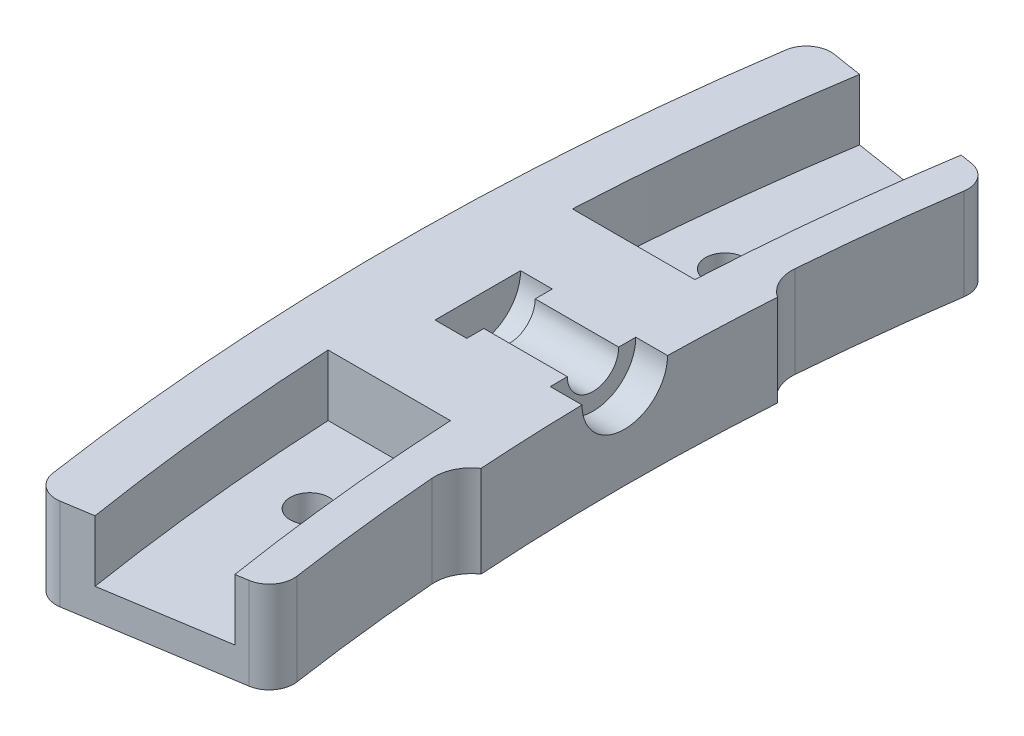
ISO-10303-21;
HEADER;
FILE_DESCRIPTION(('STEP AP214'),'2;1');
FILE_NAME('part.step','',(''),(''),'','','');
FILE_SCHEMA(('AUTOMOTIVE_DESIGN { 1 0 10303 214 1 1 1 1 }'));
ENDSEC;
DATA;
#1=APPLICATION_CONTEXT('core data for automotive mechanical design processes');
#2=APPLICATION_PROTOCOL_DEFINITION('international standard','automotive_design',2000,#1);
#3=PRODUCT_CONTEXT('',#1,'mechanical');
#4=PRODUCT('Part','Part','',(#3));
#5=PRODUCT_RELATED_PRODUCT_CATEGORY('part','',(#4));
#6=PRODUCT_DEFINITION_FORMATION('','',#4);
#7=PRODUCT_DEFINITION_CONTEXT('part definition',#1,'design');
#8=PRODUCT_DEFINITION('design','',#6,#7);
#9=PRODUCT_DEFINITION_SHAPE('','',#8);
#10=(LENGTH_UNIT() NAMED_UNIT(*) SI_UNIT(.MILLI.,.METRE.));
#11=(NAMED_UNIT(*) PLANE_ANGLE_UNIT() SI_UNIT($,.RADIAN.));
#12=(NAMED_UNIT(*) SI_UNIT($,.STERADIAN.) SOLID_ANGLE_UNIT());
#13=UNCERTAINTY_MEASURE_WITH_UNIT(LENGTH_MEASURE(1.E-05),#10,'distance_accuracy_value','');
#14=(GEOMETRIC_REPRESENTATION_CONTEXT(3) GLOBAL_UNCERTAINTY_ASSIGNED_CONTEXT((#13)) GLOBAL_UNIT_ASSIGNED_CONTEXT((#10,
#11,#12)) REPRESENTATION_CONTEXT('',''));
#15=CARTESIAN_POINT('',(0.,0.,0.));
#16=DIRECTION('',(0.,0.,1.));
#17=DIRECTION('',(1.,0.,0.));
#18=AXIS2_PLACEMENT_3D('',#15,#16,#17);
#19=CARTESIAN_POINT('',(0.,10.,0.));
#20=DIRECTION('',(0.,-1.,0.));
#21=DIRECTION('',(0.,0.,-1.));
#22=AXIS2_PLACEMENT_3D('',#19,#20,#21);
#23=CYLINDRICAL_SURFACE('',#22,185.5);
#24=CARTESIAN_POINT('',(-185.466978192885,10.,3.5));
#25=CARTESIAN_POINT('',(-185.466977430939,9.9015687384195,3.50000944061988));
#26=CARTESIAN_POINT('',(-185.467056536335,9.80314196188526,3.49584772852682));
#27=CARTESIAN_POINT('',(-185.467368855888,9.60699276190361,3.47925506337131));
#28=CARTESIAN_POINT('',(-185.467602062565,9.50927030450143,3.46682451167631));
#29=CARTESIAN_POINT('',(-185.468216741485,9.31528432602201,3.43377895386924));
#30=CARTESIAN_POINT('',(-185.468598108343,9.21901981836457,3.41316976496929));
#31=CARTESIAN_POINT('',(-185.469497617825,9.0285929662776,3.36393426603974));
#32=CARTESIAN_POINT('',(-185.470015758806,8.93443059661093,3.33530805231412));
#33=CARTESIAN_POINT('',(-185.471755316775,8.65600881932055,3.23763660090777));
#34=CARTESIAN_POINT('',(-185.473162149319,8.47573195361422,3.1567843740943));
#35=CARTESIAN_POINT('',(-185.476310472255,8.13144657686858,2.96602237242094));
#36=CARTESIAN_POINT('',(-185.478051897782,7.96743492200355,2.85611822798098));
#37=CARTESIAN_POINT('',(-185.481673830463,7.66013870584937,2.61031457726575));
#38=CARTESIAN_POINT('',(-185.483554356072,7.5168569023782,2.47441161778505));
#39=CARTESIAN_POINT('',(-185.487242545187,7.2551268801705,2.18046178905099));
#40=CARTESIAN_POINT('',(-185.489050197554,7.13668244637189,2.02241155091272));
#41=CARTESIAN_POINT('',(-185.492388616318,6.92800421618842,1.68866047564039));
#42=CARTESIAN_POINT('',(-185.493919374273,6.83777127989765,1.5129591005855));
#43=CARTESIAN_POINT('',(-185.496531252063,6.68809125509202,1.14890943189333));
#44=CARTESIAN_POINT('',(-185.497612400989,6.62864217475321,0.960561957394287));
#45=CARTESIAN_POINT('',(-185.499203226703,6.54221396354895,0.576576330685113));
#46=CARTESIAN_POINT('',(-185.499712960763,6.51523157863379,0.380938911153274));
#47=CARTESIAN_POINT('',(-185.500103688222,6.49449277728218,-0.0120942016270648));
#48=CARTESIAN_POINT('',(-185.499984667711,6.5007370959074,-0.209489933677596));
#49=CARTESIAN_POINT('',(-185.499131332768,6.54627267400048,-0.600403183315255));
#50=CARTESIAN_POINT('',(-185.498397102807,6.58555939657907,-0.793921229593717));
#51=CARTESIAN_POINT('',(-185.4963962187,6.69605748961318,-1.1716138975672));
#52=CARTESIAN_POINT('',(-185.495129566015,6.76726877236852,-1.35578854492799));
#53=CARTESIAN_POINT('',(-185.492206448889,6.93960136811131,-1.70958526125016));
#54=CARTESIAN_POINT('',(-185.490549949042,7.04072539785483,-1.8792060065811));
#55=CARTESIAN_POINT('',(-185.487033980167,7.27000593863789,-2.19905613244699));
#56=CARTESIAN_POINT('',(-185.485174520891,7.39816115100552,-2.34928644400701));
#57=CARTESIAN_POINT('',(-185.481462067495,7.67787076446033,-2.62610683719889));
#58=CARTESIAN_POINT('',(-185.479609073517,7.82942567372652,-2.75269640528488));
#59=CARTESIAN_POINT('',(-185.476117893751,8.15169764500471,-2.97867604968195));
#60=CARTESIAN_POINT('',(-185.474479776318,8.32242077279799,-3.07805748157784));
#61=CARTESIAN_POINT('',(-185.471602891485,8.67820485888656,-3.24679456806405));
#62=CARTESIAN_POINT('',(-185.470364368728,8.86327451485222,-3.31613183768991));
#63=CARTESIAN_POINT('',(-185.468429637325,9.24228661070111,-3.4226441377642));
#64=CARTESIAN_POINT('',(-185.46773260079,9.43621502360441,-3.45986827637525));
#65=CARTESIAN_POINT('',(-185.467222256108,9.69286188419213,-3.48704466585147));
#66=CARTESIAN_POINT('',(-185.467130779183,9.75424289207597,-3.49190547814548));
#67=CARTESIAN_POINT('',(-185.467008829149,9.87707430779331,-3.4983787108036));
#68=CARTESIAN_POINT('',(-185.466978255392,9.93852443293174,-3.49999649055059));
#69=CARTESIAN_POINT('',(-185.466978192885,10.,-3.5));
#70=B_SPLINE_CURVE_WITH_KNOTS('',3,(#24,#25,#26,#27,#28,#29,#30,#31,#32,#33,#34,#35,#36,#37,#38,
#39,#40,#41,#42,#43,#44,#45,#46,#47,#48,#49,#50,#51,#52,#53,#54,#55,#56,#57,#58,#59,#60,#61,#62,
#63,#64,#65,#66,#67,#68,#69),.UNSPECIFIED.,.F.,.F.,(4,2,2,2,2,2,2,2,2,2,2,2,2,2,2,2,2,2,2,2,2,2,
4),(0.,0.295197718043894,0.590381108307984,0.885354918967891,1.18032518642624,1.77001690874315,
2.35959442927563,2.9492503129033,3.5389959883104,4.12875964175322,4.71848513063973,
5.30815150799945,5.89783093037721,6.48742940000169,7.07702624994621,7.66667666511143,
8.25629875787279,8.84593365745524,9.43575567567413,10.0259381164931,10.6152164283205,
10.7998763838495,10.9842309209289),.UNSPECIFIED.);
#71=CARTESIAN_POINT('',(-185.466978192885,10.,3.5));
#72=VERTEX_POINT('',#71);
#73=CARTESIAN_POINT('',(-185.466978192885,10.,-3.5));
#74=VERTEX_POINT('',#73);
#75=EDGE_CURVE('E214',#72,#74,#70,.T.);
#76=ORIENTED_EDGE('',*,*,#75,.F.);
#77=CARTESIAN_POINT('',(0.,10.,0.));
#78=DIRECTION('',(0.,-1.,0.));
#79=DIRECTION('',(0.,0.,1.));
#80=AXIS2_PLACEMENT_3D('',#77,#78,#79);
#81=CIRCLE('',#80,185.5);
#82=CARTESIAN_POINT('',(-185.102830260761,10.,12.1322804721917));
#83=VERTEX_POINT('',#82);
#84=EDGE_CURVE('E224',#83,#72,#81,.T.);
#85=ORIENTED_EDGE('',*,*,#84,.F.);
#86=DIRECTION('',(0.,-1.,0.));
#87=VECTOR('',#86,1.);
#88=CARTESIAN_POINT('',(-185.102830260761,10.,12.1322804721917));
#89=LINE('',#88,#87);
#90=CARTESIAN_POINT('',(-185.102830260761,2.5,12.1322804721918));
#91=VERTEX_POINT('',#90);
#92=EDGE_CURVE('E231',#83,#91,#89,.T.);
#93=ORIENTED_EDGE('',*,*,#92,.T.);
#94=CARTESIAN_POINT('',(0.,2.5,0.));
#95=DIRECTION('',(0.,1.,0.));
#96=DIRECTION('',(0.,0.,-1.));
#97=AXIS2_PLACEMENT_3D('',#94,#95,#96);
#98=CIRCLE('',#97,185.5);
#99=CARTESIAN_POINT('',(-185.102830260761,2.5,-12.1322804721913));
#100=VERTEX_POINT('',#99);
#101=EDGE_CURVE('E370',#100,#91,#98,.T.);
#102=ORIENTED_EDGE('',*,*,#101,.F.);
#103=DIRECTION('',(0.,-1.,0.));
#104=VECTOR('',#103,1.);
#105=CARTESIAN_POINT('',(-185.102830260761,10.,-12.1322804721916));
#106=LINE('',#105,#104);
#107=CARTESIAN_POINT('',(-185.102830260761,10.,-12.1322804721916));
#108=VERTEX_POINT('',#107);
#109=EDGE_CURVE('E234',#108,#100,#106,.T.);
#110=ORIENTED_EDGE('',*,*,#109,.F.);
#111=EDGE_CURVE('E232',#74,#108,#81,.T.);
#112=ORIENTED_EDGE('',*,*,#111,.F.);
#113=EDGE_LOOP('',(#76,#85,#93,#102,#110,#112));
#114=FACE_BOUND('',#113,.T.);
#115=ADVANCED_FACE('F35',(#114),#23,.F.);
#116=CARTESIAN_POINT('',(0.,10.,0.));
#117=DIRECTION('',(0.,1.,0.));
#118=DIRECTION('',(0.,0.,1.));
#119=AXIS2_PLACEMENT_3D('',#116,#117,#118);
#120=PLANE('',#119);
#121=ORIENTED_EDGE('',*,*,#84,.T.);
#122=DIRECTION('',(-1.,0.,0.));
#123=VECTOR('',#122,1.);
#124=CARTESIAN_POINT('',(-197.5,10.,3.5));
#125=LINE('',#124,#123);
#126=CARTESIAN_POINT('',(-188.066978192885,10.,3.5));
#127=VERTEX_POINT('',#126);
#128=EDGE_CURVE('E11',#72,#127,#125,.T.);
#129=ORIENTED_EDGE('',*,*,#128,.T.);
#130=DIRECTION('',(0.,0.,-1.));
#131=VECTOR('',#130,1.);
#132=CARTESIAN_POINT('',(-188.066978192885,10.,0.));
#133=LINE('',#132,#131);
#134=CARTESIAN_POINT('',(-188.066978192885,10.,2.1));
#135=VERTEX_POINT('',#134);
#136=EDGE_CURVE('E207',#127,#135,#133,.T.);
#137=ORIENTED_EDGE('',*,*,#136,.T.);
#138=DIRECTION('',(-1.,0.,0.));
#139=VECTOR('',#138,1.);
#140=CARTESIAN_POINT('',(-184.97551328148,10.,2.1));
#141=LINE('',#140,#139);
#142=CARTESIAN_POINT('',(-194.9,10.,2.1));
#143=VERTEX_POINT('',#142);
#144=EDGE_CURVE('E480',#135,#143,#141,.T.);
#145=ORIENTED_EDGE('',*,*,#144,.T.);
#146=DIRECTION('',(0.,0.,-1.));
#147=VECTOR('',#146,1.);
#148=CARTESIAN_POINT('',(-194.9,10.,0.));
#149=LINE('',#148,#147);
#150=CARTESIAN_POINT('',(-194.9,10.,3.5));
#151=VERTEX_POINT('',#150);
#152=EDGE_CURVE('E479',#151,#143,#149,.T.);
#153=ORIENTED_EDGE('',*,*,#152,.F.);
#154=DIRECTION('',(-1.,0.,0.));
#155=VECTOR('',#154,1.);
#156=CARTESIAN_POINT('',(-194.9,10.,3.5));
#157=LINE('',#156,#155);
#158=CARTESIAN_POINT('',(-197.5,10.,3.5));
#159=VERTEX_POINT('',#158);
#160=EDGE_CURVE('E362',#151,#159,#157,.T.);
#161=ORIENTED_EDGE('',*,*,#160,.T.);
#162=DIRECTION('',(0.,0.,-1.));
#163=VECTOR('',#162,1.);
#164=CARTESIAN_POINT('',(-197.5,10.,0.));
#165=LINE('',#164,#163);
#166=CARTESIAN_POINT('',(-197.5,10.,-3.5));
#167=VERTEX_POINT('',#166);
#168=EDGE_CURVE('E355',#159,#167,#165,.T.);
#169=ORIENTED_EDGE('',*,*,#168,.T.);
#170=DIRECTION('',(-1.,0.,0.));
#171=VECTOR('',#170,1.);
#172=CARTESIAN_POINT('',(-194.9,10.,-3.5));
#173=LINE('',#172,#171);
#174=CARTESIAN_POINT('',(-194.9,10.,-3.5));
#175=VERTEX_POINT('',#174);
#176=EDGE_CURVE('E359',#167,#175,#173,.F.);
#177=ORIENTED_EDGE('',*,*,#176,.T.);
#178=CARTESIAN_POINT('',(-194.9,10.,-2.1));
#179=VERTEX_POINT('',#178);
#180=EDGE_CURVE('E476',#179,#175,#149,.T.);
#181=ORIENTED_EDGE('',*,*,#180,.F.);
#182=DIRECTION('',(-1.,0.,0.));
#183=VECTOR('',#182,1.);
#184=CARTESIAN_POINT('',(-184.97551328148,10.,-2.1));
#185=LINE('',#184,#183);
#186=CARTESIAN_POINT('',(-188.066978192885,10.,-2.1));
#187=VERTEX_POINT('',#186);
#188=EDGE_CURVE('E236',#179,#187,#185,.F.);
#189=ORIENTED_EDGE('',*,*,#188,.T.);
#190=CARTESIAN_POINT('',(-188.066978192885,10.,-3.5));
#191=VERTEX_POINT('',#190);
#192=EDGE_CURVE('E50',#187,#191,#133,.T.);
#193=ORIENTED_EDGE('',*,*,#192,.T.);
#194=DIRECTION('',(-1.,0.,0.));
#195=VECTOR('',#194,1.);
#196=CARTESIAN_POINT('',(-197.5,10.,-3.5));
#197=LINE('',#196,#195);
#198=EDGE_CURVE('E43',#191,#74,#197,.F.);
#199=ORIENTED_EDGE('',*,*,#198,.T.);
#200=ORIENTED_EDGE('',*,*,#111,.T.);
#201=CARTESIAN_POINT('',(-183.418657042006,10.,-14.6149323948795));
#202=DIRECTION('',(0.,1.,0.));
#203=DIRECTION('',(0.,0.,1.));
#204=AXIS2_PLACEMENT_3D('',#201,#202,#203);
#205=CIRCLE('',#204,3.);
#206=CARTESIAN_POINT('',(-186.409178624213,10.,-14.8532193361004));
#207=VERTEX_POINT('',#206);
#208=EDGE_CURVE('E323',#108,#207,#205,.F.);
#209=ORIENTED_EDGE('',*,*,#208,.T.);
#210=CARTESIAN_POINT('',(0.,10.,0.));
#211=DIRECTION('',(0.,1.,0.));
#212=DIRECTION('',(0.,0.,1.));
#213=AXIS2_PLACEMENT_3D('',#210,#211,#212);
#214=CIRCLE('',#213,187.);
#215=CARTESIAN_POINT('',(-184.996936421358,10.,-27.2971338186249));
#216=VERTEX_POINT('',#215);
#217=EDGE_CURVE('E308',#216,#207,#214,.T.);
#218=ORIENTED_EDGE('',*,*,#217,.F.);
#219=CARTESIAN_POINT('',(-186.97551328148,10.,-27.5890817739043));
#220=DIRECTION('',(0.,1.,0.));
#221=DIRECTION('',(0.,0.,1.));
#222=AXIS2_PLACEMENT_3D('',#219,#220,#221);
#223=CIRCLE('',#222,2.);
#224=CARTESIAN_POINT('',(-186.662644351399,10.,-29.5644584550946));
#225=VERTEX_POINT('',#224);
#226=EDGE_CURVE('E337',#216,#225,#223,.T.);
#227=ORIENTED_EDGE('',*,*,#226,.T.);
#228=DIRECTION('',(0.987688340595138,0.,0.156434465040232));
#229=VECTOR('',#228,1.);
#230=CARTESIAN_POINT('',(0.,10.,0.));
#231=LINE('',#230,#229);
#232=CARTESIAN_POINT('',(-187.660784713076,10.,-29.7225483576441));
#233=VERTEX_POINT('',#232);
#234=EDGE_CURVE('E310',#233,#225,#231,.T.);
#235=ORIENTED_EDGE('',*,*,#234,.F.);
#236=CARTESIAN_POINT('',(0.,10.,0.));
#237=DIRECTION('',(0.,1.,0.));
#238=DIRECTION('',(0.,0.,1.));
#239=AXIS2_PLACEMENT_3D('',#236,#237,#238);
#240=CIRCLE('',#239,190.);
#241=CARTESIAN_POINT('',(-189.736659610103,10.,-9.99999999999999));
#242=VERTEX_POINT('',#241);
#243=EDGE_CURVE('E250',#233,#242,#240,.T.);
#244=ORIENTED_EDGE('',*,*,#243,.T.);
#245=DIRECTION('',(-1.,0.,0.));
#246=VECTOR('',#245,1.);
#247=CARTESIAN_POINT('',(0.,10.,-10.));
#248=LINE('',#247,#246);
#249=CARTESIAN_POINT('',(-199.749843554382,10.,-9.99999999999999));
#250=VERTEX_POINT('',#249);
#251=EDGE_CURVE('E261',#242,#250,#248,.T.);
#252=ORIENTED_EDGE('',*,*,#251,.T.);
#253=CARTESIAN_POINT('',(0.,10.,0.));
#254=DIRECTION('',(0.,1.,0.));
#255=DIRECTION('',(0.,0.,1.));
#256=AXIS2_PLACEMENT_3D('',#253,#254,#255);
#257=CIRCLE('',#256,200.);
#258=CARTESIAN_POINT('',(-197.537668119028,10.,-31.2868930080464));
#259=VERTEX_POINT('',#258);
#260=EDGE_CURVE('E258',#259,#250,#257,.T.);
#261=ORIENTED_EDGE('',*,*,#260,.F.);
#262=CARTESIAN_POINT('',(-199.997133786041,10.,-31.6764341012137));
#263=VERTEX_POINT('',#262);
#264=EDGE_CURVE('E311',#263,#259,#231,.T.);
#265=ORIENTED_EDGE('',*,*,#264,.F.);
#266=CARTESIAN_POINT('',(-200.310002716121,10.,-29.7010574200234));
#267=DIRECTION('',(0.,1.,0.));
#268=DIRECTION('',(0.,0.,1.));
#269=AXIS2_PLACEMENT_3D('',#266,#267,#268);
#270=CIRCLE('',#269,2.);
#271=CARTESIAN_POINT('',(-202.288373113317,10.,-29.9944011970113));
#272=VERTEX_POINT('',#271);
#273=EDGE_CURVE('E343',#263,#272,#270,.T.);
#274=ORIENTED_EDGE('',*,*,#273,.T.);
#275=CARTESIAN_POINT('',(0.,10.,0.));
#276=DIRECTION('',(0.,1.,0.));
#277=DIRECTION('',(0.,0.,1.));
#278=AXIS2_PLACEMENT_3D('',#275,#276,#277);
#279=CIRCLE('',#278,204.5);
#280=CARTESIAN_POINT('',(-202.288373113317,10.,29.9944011970112));
#281=VERTEX_POINT('',#280);
#282=EDGE_CURVE('E313',#272,#281,#279,.T.);
#283=ORIENTED_EDGE('',*,*,#282,.T.);
#284=CARTESIAN_POINT('',(-200.310002716121,10.,29.7010574200233));
#285=DIRECTION('',(0.,1.,0.));
#286=DIRECTION('',(0.,0.,1.));
#287=AXIS2_PLACEMENT_3D('',#284,#285,#286);
#288=CIRCLE('',#287,2.);
#289=CARTESIAN_POINT('',(-199.997133786041,10.,31.6764341012136));
#290=VERTEX_POINT('',#289);
#291=EDGE_CURVE('E341',#281,#290,#288,.T.);
#292=ORIENTED_EDGE('',*,*,#291,.T.);
#293=DIRECTION('',(-0.987688340595138,0.,0.156434465040231));
#294=VECTOR('',#293,1.);
#295=CARTESIAN_POINT('',(0.,10.,0.));
#296=LINE('',#295,#294);
#297=CARTESIAN_POINT('',(-197.537668119028,10.,31.2868930080463));
#298=VERTEX_POINT('',#297);
#299=EDGE_CURVE('E270',#298,#290,#296,.T.);
#300=ORIENTED_EDGE('',*,*,#299,.F.);
#301=CARTESIAN_POINT('',(0.,10.,0.));
#302=DIRECTION('',(0.,1.,0.));
#303=DIRECTION('',(0.,0.,1.));
#304=AXIS2_PLACEMENT_3D('',#301,#302,#303);
#305=CIRCLE('',#304,200.);
#306=CARTESIAN_POINT('',(-199.749843554382,10.,10.));
#307=VERTEX_POINT('',#306);
#308=EDGE_CURVE('E292',#307,#298,#305,.T.);
#309=ORIENTED_EDGE('',*,*,#308,.F.);
#310=DIRECTION('',(-1.,0.,0.));
#311=VECTOR('',#310,1.);
#312=CARTESIAN_POINT('',(0.,10.,10.));
#313=LINE('',#312,#311);
#314=CARTESIAN_POINT('',(-189.736659610103,10.,10.));
#315=VERTEX_POINT('',#314);
#316=EDGE_CURVE('E290',#315,#307,#313,.T.);
#317=ORIENTED_EDGE('',*,*,#316,.F.);
#318=CARTESIAN_POINT('',(0.,10.,0.));
#319=DIRECTION('',(0.,1.,0.));
#320=DIRECTION('',(0.,0.,1.));
#321=AXIS2_PLACEMENT_3D('',#318,#319,#320);
#322=CIRCLE('',#321,190.);
#323=CARTESIAN_POINT('',(-187.660784713076,10.,29.7225483576439));
#324=VERTEX_POINT('',#323);
#325=EDGE_CURVE('E281',#315,#324,#322,.T.);
#326=ORIENTED_EDGE('',*,*,#325,.T.);
#327=CARTESIAN_POINT('',(-186.662644351399,10.,29.5644584550944));
#328=VERTEX_POINT('',#327);
#329=EDGE_CURVE('E305',#328,#324,#296,.T.);
#330=ORIENTED_EDGE('',*,*,#329,.F.);
#331=CARTESIAN_POINT('',(-186.97551328148,10.,27.5890817739042));
#332=DIRECTION('',(0.,1.,0.));
#333=DIRECTION('',(0.,0.,1.));
#334=AXIS2_PLACEMENT_3D('',#331,#332,#333);
#335=CIRCLE('',#334,2.);
#336=CARTESIAN_POINT('',(-184.996936421358,10.,27.2971338186247));
#337=VERTEX_POINT('',#336);
#338=EDGE_CURVE('E339',#328,#337,#335,.T.);
#339=ORIENTED_EDGE('',*,*,#338,.T.);
#340=CARTESIAN_POINT('',(-186.409178624213,10.,14.8532193361011));
#341=VERTEX_POINT('',#340);
#342=EDGE_CURVE('E307',#341,#337,#214,.T.);
#343=ORIENTED_EDGE('',*,*,#342,.F.);
#344=CARTESIAN_POINT('',(-183.418657042006,10.,14.6149323948802));
#345=DIRECTION('',(0.,1.,0.));
#346=DIRECTION('',(0.,0.,1.));
#347=AXIS2_PLACEMENT_3D('',#344,#345,#346);
#348=CIRCLE('',#347,3.);
#349=EDGE_CURVE('E227',#341,#83,#348,.F.);
#350=ORIENTED_EDGE('',*,*,#349,.T.);
#351=EDGE_LOOP('',(#121,#129,#137,#145,#153,#161,#169,#177,#181,#189,#193,#199,#200,#209,#218,
#227,#235,#244,#252,#261,#265,#274,#283,#292,#300,#309,#317,#326,#330,#339,#343,#350));
#352=FACE_BOUND('',#351,.T.);
#353=ADVANCED_FACE('F222',(#352),#120,.T.);
#354=CARTESIAN_POINT('',(-184.97551328148,10.,0.));
#355=DIRECTION('',(-1.,0.,0.));
#356=DIRECTION('',(0.,0.,1.));
#357=AXIS2_PLACEMENT_3D('',#354,#355,#356);
#358=CYLINDRICAL_SURFACE('',#357,2.1);
#359=ORIENTED_EDGE('',*,*,#144,.F.);
#360=CARTESIAN_POINT('',(-188.066978192885,10.,0.));
#361=DIRECTION('',(1.,0.,0.));
#362=DIRECTION('',(0.,0.,-1.));
#363=AXIS2_PLACEMENT_3D('',#360,#361,#362);
#364=CIRCLE('',#363,2.1);
#365=EDGE_CURVE('E211',#135,#187,#364,.T.);
#366=ORIENTED_EDGE('',*,*,#365,.T.);
#367=ORIENTED_EDGE('',*,*,#188,.F.);
#368=CARTESIAN_POINT('',(-194.9,10.,0.));
#369=DIRECTION('',(1.,0.,0.));
#370=DIRECTION('',(0.,0.,-1.));
#371=AXIS2_PLACEMENT_3D('',#368,#369,#370);
#372=CIRCLE('',#371,2.1);
#373=EDGE_CURVE('E357',#143,#179,#372,.T.);
#374=ORIENTED_EDGE('',*,*,#373,.F.);
#375=EDGE_LOOP('',(#359,#366,#367,#374));
#376=FACE_BOUND('',#375,.T.);
#377=ADVANCED_FACE('F490',(#376),#358,.F.);
#378=CARTESIAN_POINT('',(0.,10.,0.));
#379=DIRECTION('',(0.,-1.,0.));
#380=DIRECTION('',(0.,0.,-1.));
#381=AXIS2_PLACEMENT_3D('',#378,#379,#380);
#382=CYLINDRICAL_SURFACE('',#381,187.);
#383=DIRECTION('',(0.,-1.,0.));
#384=VECTOR('',#383,1.);
#385=CARTESIAN_POINT('',(-186.409178624213,10.,-14.8532193361004));
#386=LINE('',#385,#384);
#387=CARTESIAN_POINT('',(-186.409178624213,2.5,-14.8532193361002));
#388=VERTEX_POINT('',#387);
#389=EDGE_CURVE('E316',#207,#388,#386,.T.);
#390=ORIENTED_EDGE('',*,*,#389,.T.);
#391=CARTESIAN_POINT('',(0.,2.5,0.));
#392=DIRECTION('',(0.,1.,0.));
#393=DIRECTION('',(0.,0.,-1.));
#394=AXIS2_PLACEMENT_3D('',#391,#392,#393);
#395=CIRCLE('',#394,187.);
#396=CARTESIAN_POINT('',(-184.996936421358,2.5,-27.2971338186249));
#397=VERTEX_POINT('',#396);
#398=EDGE_CURVE('E778',#397,#388,#395,.T.);
#399=ORIENTED_EDGE('',*,*,#398,.F.);
#400=DIRECTION('',(0.,-1.,0.));
#401=VECTOR('',#400,1.);
#402=CARTESIAN_POINT('',(-184.996936421358,10.,-27.2971338186249));
#403=LINE('',#402,#401);
#404=EDGE_CURVE('E353',#397,#216,#403,.F.);
#405=ORIENTED_EDGE('',*,*,#404,.T.);
#406=ORIENTED_EDGE('',*,*,#217,.T.);
#407=EDGE_LOOP('',(#390,#399,#405,#406));
#408=FACE_BOUND('',#407,.T.);
#409=ADVANCED_FACE('F577',(#408),#382,.F.);
#410=DIRECTION('',(0.,-1.,0.));
#411=VECTOR('',#410,1.);
#412=CARTESIAN_POINT('',(-184.996936421358,10.,27.2971338186247));
#413=LINE('',#412,#411);
#414=CARTESIAN_POINT('',(-184.996936421358,2.5,27.2971338186247));
#415=VERTEX_POINT('',#414);
#416=EDGE_CURVE('E350',#337,#415,#413,.T.);
#417=ORIENTED_EDGE('',*,*,#416,.T.);
#418=CARTESIAN_POINT('',(0.,2.5,0.));
#419=DIRECTION('',(0.,1.,0.));
#420=DIRECTION('',(0.,0.,-1.));
#421=AXIS2_PLACEMENT_3D('',#418,#419,#420);
#422=CIRCLE('',#421,187.);
#423=CARTESIAN_POINT('',(-186.409178624213,2.5,14.8532193361011));
#424=VERTEX_POINT('',#423);
#425=EDGE_CURVE('E452',#424,#415,#422,.T.);
#426=ORIENTED_EDGE('',*,*,#425,.F.);
#427=DIRECTION('',(0.,-1.,0.));
#428=VECTOR('',#427,1.);
#429=CARTESIAN_POINT('',(-186.409178624213,10.,14.8532193361011));
#430=LINE('',#429,#428);
#431=EDGE_CURVE('E321',#424,#341,#430,.F.);
#432=ORIENTED_EDGE('',*,*,#431,.T.);
#433=ORIENTED_EDGE('',*,*,#342,.T.);
#434=EDGE_LOOP('',(#417,#426,#432,#433));
#435=FACE_BOUND('',#434,.T.);
#436=ADVANCED_FACE('F451',(#435),#382,.F.);
#437=CARTESIAN_POINT('',(0.,10.,0.));
#438=DIRECTION('',(0.156434465040231,0.,0.987688340595138));
#439=DIRECTION('',(0.987688340595138,0.,-0.156434465040231));
#440=AXIS2_PLACEMENT_3D('',#437,#438,#439);
#441=PLANE('',#440);
#442=DIRECTION('',(0.,1.,0.));
#443=VECTOR('',#442,1.);
#444=CARTESIAN_POINT('',(-199.997133786041,0.,31.6764341012135));
#445=LINE('',#444,#443);
#446=CARTESIAN_POINT('',(-199.997133786041,2.5,31.6764341012136));
#447=VERTEX_POINT('',#446);
#448=EDGE_CURVE('E347',#290,#447,#445,.F.);
#449=ORIENTED_EDGE('',*,*,#448,.T.);
#450=DIRECTION('',(-0.987688340595138,0.,0.156434465040229));
#451=VECTOR('',#450,1.);
#452=CARTESIAN_POINT('',(-186.662644351399,2.5,29.5644584550945));
#453=LINE('',#452,#451);
#454=CARTESIAN_POINT('',(-186.662644351399,2.5,29.5644584550945));
#455=VERTEX_POINT('',#454);
#456=EDGE_CURVE('E425',#455,#447,#453,.T.);
#457=ORIENTED_EDGE('',*,*,#456,.F.);
#458=DIRECTION('',(0.,-1.,0.));
#459=VECTOR('',#458,1.);
#460=CARTESIAN_POINT('',(-186.662644351399,10.,29.5644584550944));
#461=LINE('',#460,#459);
#462=EDGE_CURVE('E345',#455,#328,#461,.F.);
#463=ORIENTED_EDGE('',*,*,#462,.T.);
#464=ORIENTED_EDGE('',*,*,#329,.T.);
#465=DIRECTION('',(0.,1.,0.));
#466=VECTOR('',#465,1.);
#467=CARTESIAN_POINT('',(-187.660784713076,5.,29.7225483576439));
#468=LINE('',#467,#466);
#469=CARTESIAN_POINT('',(-187.660784713076,5.,29.7225483576439));
#470=VERTEX_POINT('',#469);
#471=EDGE_CURVE('E297',#470,#324,#468,.T.);
#472=ORIENTED_EDGE('',*,*,#471,.F.);
#473=DIRECTION('',(0.987688340595138,0.,-0.156434465040231));
#474=VECTOR('',#473,1.);
#475=CARTESIAN_POINT('',(0.,5.,0.));
#476=LINE('',#475,#474);
#477=CARTESIAN_POINT('',(-197.537668119028,5.,31.2868930080463));
#478=VERTEX_POINT('',#477);
#479=EDGE_CURVE('E284',#478,#470,#476,.T.);
#480=ORIENTED_EDGE('',*,*,#479,.F.);
#481=DIRECTION('',(0.,1.,0.));
#482=VECTOR('',#481,1.);
#483=CARTESIAN_POINT('',(-197.537668119028,5.,31.2868930080463));
#484=LINE('',#483,#482);
#485=EDGE_CURVE('E300',#478,#298,#484,.T.);
#486=ORIENTED_EDGE('',*,*,#485,.T.);
#487=ORIENTED_EDGE('',*,*,#299,.T.);
#488=EDGE_LOOP('',(#449,#457,#463,#464,#472,#480,#486,#487));
#489=FACE_BOUND('',#488,.T.);
#490=ADVANCED_FACE('F424',(#489),#441,.T.);
#491=CARTESIAN_POINT('',(0.,10.,0.));
#492=DIRECTION('',(0.156434465040232,0.,-0.987688340595138));
#493=DIRECTION('',(-0.987688340595138,0.,-0.156434465040232));
#494=AXIS2_PLACEMENT_3D('',#491,#492,#493);
#495=PLANE('',#494);
#496=DIRECTION('',(0.,-1.,0.));
#497=VECTOR('',#496,1.);
#498=CARTESIAN_POINT('',(-186.662644351399,10.,-29.5644584550946));
#499=LINE('',#498,#497);
#500=CARTESIAN_POINT('',(-186.662644351399,2.5,-29.5644584550946));
#501=VERTEX_POINT('',#500);
#502=EDGE_CURVE('E332',#225,#501,#499,.T.);
#503=ORIENTED_EDGE('',*,*,#502,.T.);
#504=DIRECTION('',(0.987688340595138,0.,0.156434465040232));
#505=VECTOR('',#504,1.);
#506=CARTESIAN_POINT('',(-199.997133786041,2.5,-31.6764341012137));
#507=LINE('',#506,#505);
#508=CARTESIAN_POINT('',(-199.997133786041,2.5,-31.6764341012137));
#509=VERTEX_POINT('',#508);
#510=EDGE_CURVE('E58',#509,#501,#507,.T.);
#511=ORIENTED_EDGE('',*,*,#510,.F.);
#512=DIRECTION('',(0.,1.,0.));
#513=VECTOR('',#512,1.);
#514=CARTESIAN_POINT('',(-199.997133786041,10.,-31.6764341012137));
#515=LINE('',#514,#513);
#516=EDGE_CURVE('E335',#509,#263,#515,.T.);
#517=ORIENTED_EDGE('',*,*,#516,.T.);
#518=ORIENTED_EDGE('',*,*,#264,.T.);
#519=DIRECTION('',(0.,1.,0.));
#520=VECTOR('',#519,1.);
#521=CARTESIAN_POINT('',(-197.537668119028,5.,-31.2868930080464));
#522=LINE('',#521,#520);
#523=CARTESIAN_POINT('',(-197.537668119028,5.,-31.2868930080464));
#524=VERTEX_POINT('',#523);
#525=EDGE_CURVE('E257',#524,#259,#522,.T.);
#526=ORIENTED_EDGE('',*,*,#525,.F.);
#527=DIRECTION('',(-0.987688340595138,0.,-0.156434465040232));
#528=VECTOR('',#527,1.);
#529=CARTESIAN_POINT('',(0.,5.,0.));
#530=LINE('',#529,#528);
#531=CARTESIAN_POINT('',(-187.660784713076,5.,-29.7225483576441));
#532=VERTEX_POINT('',#531);
#533=EDGE_CURVE('E246',#532,#524,#530,.T.);
#534=ORIENTED_EDGE('',*,*,#533,.F.);
#535=DIRECTION('',(0.,1.,0.));
#536=VECTOR('',#535,1.);
#537=CARTESIAN_POINT('',(-187.660784713076,5.,-29.7225483576441));
#538=LINE('',#537,#536);
#539=EDGE_CURVE('E267',#532,#233,#538,.T.);
#540=ORIENTED_EDGE('',*,*,#539,.T.);
#541=ORIENTED_EDGE('',*,*,#234,.T.);
#542=EDGE_LOOP('',(#503,#511,#517,#518,#526,#534,#540,#541));
#543=FACE_BOUND('',#542,.T.);
#544=ADVANCED_FACE('F385',(#543),#495,.T.);
#545=CARTESIAN_POINT('',(0.,10.,0.));
#546=DIRECTION('',(0.,-1.,0.));
#547=DIRECTION('',(0.,0.,-1.));
#548=AXIS2_PLACEMENT_3D('',#545,#546,#547);
#549=CYLINDRICAL_SURFACE('',#548,204.5);
#550=CARTESIAN_POINT('',(0.,2.5,0.));
#551=DIRECTION('',(0.,-1.,0.));
#552=DIRECTION('',(0.,0.,-1.));
#553=AXIS2_PLACEMENT_3D('',#550,#551,#552);
#554=CIRCLE('',#553,204.5);
#555=CARTESIAN_POINT('',(-202.288373113317,2.5,29.9944011970112));
#556=VERTEX_POINT('',#555);
#557=CARTESIAN_POINT('',(-202.288373113317,2.5,-29.9944011970112));
#558=VERTEX_POINT('',#557);
#559=EDGE_CURVE('E412',#556,#558,#554,.T.);
#560=ORIENTED_EDGE('',*,*,#559,.F.);
#561=DIRECTION('',(0.,-1.,0.));
#562=VECTOR('',#561,1.);
#563=CARTESIAN_POINT('',(-202.288373113317,10.,29.9944011970112));
#564=LINE('',#563,#562);
#565=EDGE_CURVE('E327',#556,#281,#564,.F.);
#566=ORIENTED_EDGE('',*,*,#565,.T.);
#567=ORIENTED_EDGE('',*,*,#282,.F.);
#568=DIRECTION('',(0.,-1.,0.));
#569=VECTOR('',#568,1.);
#570=CARTESIAN_POINT('',(-202.288373113317,10.,-29.9944011970113));
#571=LINE('',#570,#569);
#572=EDGE_CURVE('E329',#272,#558,#571,.T.);
#573=ORIENTED_EDGE('',*,*,#572,.T.);
#574=EDGE_LOOP('',(#560,#566,#567,#573));
#575=FACE_BOUND('',#574,.T.);
#576=ADVANCED_FACE('F411',(#575),#549,.T.);
#577=CARTESIAN_POINT('',(-194.25796612789,0.,-16.9953698357934));
#578=DIRECTION('',(0.,-1.,0.));
#579=DIRECTION('',(0.,0.,-1.));
#580=AXIS2_PLACEMENT_3D('',#577,#578,#579);
#581=CYLINDRICAL_SURFACE('',#580,1.59999999999999);
#582=CARTESIAN_POINT('',(-194.25796612789,5.,-16.9953698357934));
#583=DIRECTION('',(0.,1.,0.));
#584=DIRECTION('',(0.,0.,1.));
#585=AXIS2_PLACEMENT_3D('',#582,#583,#584);
#586=CIRCLE('',#585,1.59999999999999);
#587=CARTESIAN_POINT('',(-194.25796612789,5.,-15.3953698357934));
#588=VERTEX_POINT('',#587);
#589=EDGE_CURVE('E245',#588,#588,#586,.T.);
#590=ORIENTED_EDGE('',*,*,#589,.T.);
#591=EDGE_LOOP('',(#590));
#592=FACE_BOUND('',#591,.T.);
#593=CARTESIAN_POINT('',(-194.25796612789,2.5,-16.9953698357934));
#594=DIRECTION('',(0.,-1.,0.));
#595=DIRECTION('',(0.,0.,-1.));
#596=AXIS2_PLACEMENT_3D('',#593,#594,#595);
#597=CIRCLE('',#596,1.59999999999999);
#598=CARTESIAN_POINT('',(-194.25796612789,2.5,-18.5953698357934));
#599=VERTEX_POINT('',#598);
#600=EDGE_CURVE('E469',#599,#599,#597,.F.);
#601=ORIENTED_EDGE('',*,*,#600,.F.);
#602=EDGE_LOOP('',(#601));
#603=FACE_BOUND('',#602,.T.);
#604=ADVANCED_FACE('F608',(#592,#603),#581,.F.);
#605=CARTESIAN_POINT('',(-194.25796612789,0.,16.9953698357934));
#606=DIRECTION('',(0.,-1.,0.));
#607=DIRECTION('',(0.,0.,-1.));
#608=AXIS2_PLACEMENT_3D('',#605,#606,#607);
#609=CYLINDRICAL_SURFACE('',#608,1.59999999999999);
#610=CARTESIAN_POINT('',(-194.25796612789,5.,16.9953698357934));
#611=DIRECTION('',(0.,1.,0.));
#612=DIRECTION('',(0.,0.,1.));
#613=AXIS2_PLACEMENT_3D('',#610,#611,#612);
#614=CIRCLE('',#613,1.59999999999999);
#615=CARTESIAN_POINT('',(-194.25796612789,5.,18.5953698357934));
#616=VERTEX_POINT('',#615);
#617=EDGE_CURVE('E242',#616,#616,#614,.T.);
#618=ORIENTED_EDGE('',*,*,#617,.T.);
#619=EDGE_LOOP('',(#618));
#620=FACE_BOUND('',#619,.T.);
#621=CARTESIAN_POINT('',(-194.25796612789,2.5,16.9953698357934));
#622=DIRECTION('',(0.,-1.,0.));
#623=DIRECTION('',(0.,0.,-1.));
#624=AXIS2_PLACEMENT_3D('',#621,#622,#623);
#625=CIRCLE('',#624,1.59999999999999);
#626=CARTESIAN_POINT('',(-194.25796612789,2.5,15.3953698357934));
#627=VERTEX_POINT('',#626);
#628=EDGE_CURVE('E466',#627,#627,#625,.F.);
#629=ORIENTED_EDGE('',*,*,#628,.F.);
#630=EDGE_LOOP('',(#629));
#631=FACE_BOUND('',#630,.T.);
#632=ADVANCED_FACE('F516',(#620,#631),#609,.F.);
#633=CARTESIAN_POINT('',(-183.418657042006,10.,-14.6149323948795));
#634=DIRECTION('',(0.,-1.,0.));
#635=DIRECTION('',(0.,0.,-1.));
#636=AXIS2_PLACEMENT_3D('',#633,#634,#635);
#637=CYLINDRICAL_SURFACE('',#636,3.);
#638=CARTESIAN_POINT('',(-183.418657042006,2.5,-14.6149323948795));
#639=DIRECTION('',(0.,1.,0.));
#640=DIRECTION('',(0.,0.,-1.));
#641=AXIS2_PLACEMENT_3D('',#638,#639,#640);
#642=CIRCLE('',#641,2.99999999999987);
#643=EDGE_CURVE('E460',#388,#100,#642,.T.);
#644=ORIENTED_EDGE('',*,*,#643,.F.);
#645=ORIENTED_EDGE('',*,*,#389,.F.);
#646=ORIENTED_EDGE('',*,*,#208,.F.);
#647=ORIENTED_EDGE('',*,*,#109,.T.);
#648=EDGE_LOOP('',(#644,#645,#646,#647));
#649=FACE_BOUND('',#648,.T.);
#650=ADVANCED_FACE('F374',(#649),#637,.F.);
#651=CARTESIAN_POINT('',(-183.418657042006,10.,14.6149323948802));
#652=DIRECTION('',(0.,-1.,0.));
#653=DIRECTION('',(0.,0.,-1.));
#654=AXIS2_PLACEMENT_3D('',#651,#652,#653);
#655=CYLINDRICAL_SURFACE('',#654,3.);
#656=CARTESIAN_POINT('',(-183.418657042006,2.5,14.6149323948802));
#657=DIRECTION('',(0.,1.,0.));
#658=DIRECTION('',(0.,0.,-1.));
#659=AXIS2_PLACEMENT_3D('',#656,#657,#658);
#660=CIRCLE('',#659,2.99999999999997);
#661=EDGE_CURVE('E457',#91,#424,#660,.T.);
#662=ORIENTED_EDGE('',*,*,#661,.F.);
#663=ORIENTED_EDGE('',*,*,#92,.F.);
#664=ORIENTED_EDGE('',*,*,#349,.F.);
#665=ORIENTED_EDGE('',*,*,#431,.F.);
#666=EDGE_LOOP('',(#662,#663,#664,#665));
#667=FACE_BOUND('',#666,.T.);
#668=ADVANCED_FACE('F456',(#667),#655,.F.);
#669=CARTESIAN_POINT('',(-200.310002716121,10.,-29.7010574200234));
#670=DIRECTION('',(0.,-1.,0.));
#671=DIRECTION('',(0.,0.,-1.));
#672=AXIS2_PLACEMENT_3D('',#669,#670,#671);
#673=CYLINDRICAL_SURFACE('',#672,2.);
#674=ORIENTED_EDGE('',*,*,#516,.F.);
#675=CARTESIAN_POINT('',(-200.310002716121,2.5,-29.7010574200234));
#676=DIRECTION('',(0.,-1.,0.));
#677=DIRECTION('',(0.,0.,-1.));
#678=AXIS2_PLACEMENT_3D('',#675,#676,#677);
#679=CIRCLE('',#678,2.00000000000001);
#680=EDGE_CURVE('E408',#558,#509,#679,.T.);
#681=ORIENTED_EDGE('',*,*,#680,.F.);
#682=ORIENTED_EDGE('',*,*,#572,.F.);
#683=ORIENTED_EDGE('',*,*,#273,.F.);
#684=EDGE_LOOP('',(#674,#681,#682,#683));
#685=FACE_BOUND('',#684,.T.);
#686=ADVANCED_FACE('F406',(#685),#673,.T.);
#687=CARTESIAN_POINT('',(-200.310002716121,10.,29.7010574200233));
#688=DIRECTION('',(0.,-1.,0.));
#689=DIRECTION('',(0.,0.,-1.));
#690=AXIS2_PLACEMENT_3D('',#687,#688,#689);
#691=CYLINDRICAL_SURFACE('',#690,2.);
#692=ORIENTED_EDGE('',*,*,#565,.F.);
#693=CARTESIAN_POINT('',(-200.310002716121,2.5,29.7010574200233));
#694=DIRECTION('',(0.,-1.,0.));
#695=DIRECTION('',(0.,0.,-1.));
#696=AXIS2_PLACEMENT_3D('',#693,#694,#695);
#697=CIRCLE('',#696,1.99999999999999);
#698=EDGE_CURVE('E421',#447,#556,#697,.T.);
#699=ORIENTED_EDGE('',*,*,#698,.F.);
#700=ORIENTED_EDGE('',*,*,#448,.F.);
#701=ORIENTED_EDGE('',*,*,#291,.F.);
#702=EDGE_LOOP('',(#692,#699,#700,#701));
#703=FACE_BOUND('',#702,.T.);
#704=ADVANCED_FACE('F419',(#703),#691,.T.);
#705=CARTESIAN_POINT('',(-186.97551328148,10.,27.5890817739042));
#706=DIRECTION('',(0.,-1.,0.));
#707=DIRECTION('',(0.,0.,-1.));
#708=AXIS2_PLACEMENT_3D('',#705,#706,#707);
#709=CYLINDRICAL_SURFACE('',#708,2.);
#710=ORIENTED_EDGE('',*,*,#462,.F.);
#711=CARTESIAN_POINT('',(-186.97551328148,2.5,27.5890817739042));
#712=DIRECTION('',(0.,-1.,0.));
#713=DIRECTION('',(0.,0.,-1.));
#714=AXIS2_PLACEMENT_3D('',#711,#712,#713);
#715=CIRCLE('',#714,2.00000000000003);
#716=EDGE_CURVE('E448',#415,#455,#715,.T.);
#717=ORIENTED_EDGE('',*,*,#716,.F.);
#718=ORIENTED_EDGE('',*,*,#416,.F.);
#719=ORIENTED_EDGE('',*,*,#338,.F.);
#720=EDGE_LOOP('',(#710,#717,#718,#719));
#721=FACE_BOUND('',#720,.T.);
#722=ADVANCED_FACE('F446',(#721),#709,.T.);
#723=CARTESIAN_POINT('',(-186.97551328148,10.,-27.5890817739043));
#724=DIRECTION('',(0.,-1.,0.));
#725=DIRECTION('',(0.,0.,-1.));
#726=AXIS2_PLACEMENT_3D('',#723,#724,#725);
#727=CYLINDRICAL_SURFACE('',#726,2.);
#728=ORIENTED_EDGE('',*,*,#404,.F.);
#729=CARTESIAN_POINT('',(-186.97551328148,2.5,-27.5890817739043));
#730=DIRECTION('',(0.,-1.,0.));
#731=DIRECTION('',(0.,0.,-1.));
#732=AXIS2_PLACEMENT_3D('',#729,#730,#731);
#733=CIRCLE('',#732,2.);
#734=EDGE_CURVE('E383',#501,#397,#733,.T.);
#735=ORIENTED_EDGE('',*,*,#734,.F.);
#736=ORIENTED_EDGE('',*,*,#502,.F.);
#737=ORIENTED_EDGE('',*,*,#226,.F.);
#738=EDGE_LOOP('',(#728,#735,#736,#737));
#739=FACE_BOUND('',#738,.T.);
#740=ADVANCED_FACE('F37',(#739),#727,.T.);
#741=CARTESIAN_POINT('',(0.,5.,10.));
#742=DIRECTION('',(0.,0.,-1.));
#743=DIRECTION('',(-1.,0.,0.));
#744=AXIS2_PLACEMENT_3D('',#741,#742,#743);
#745=PLANE('',#744);
#746=ORIENTED_EDGE('',*,*,#316,.T.);
#747=DIRECTION('',(0.,1.,0.));
#748=VECTOR('',#747,1.);
#749=CARTESIAN_POINT('',(-199.749843554382,5.,10.));
#750=LINE('',#749,#748);
#751=CARTESIAN_POINT('',(-199.749843554382,5.,10.));
#752=VERTEX_POINT('',#751);
#753=EDGE_CURVE('E289',#752,#307,#750,.T.);
#754=ORIENTED_EDGE('',*,*,#753,.F.);
#755=DIRECTION('',(-1.,0.,0.));
#756=VECTOR('',#755,1.);
#757=CARTESIAN_POINT('',(0.,5.,10.));
#758=LINE('',#757,#756);
#759=CARTESIAN_POINT('',(-189.736659610103,5.,10.));
#760=VERTEX_POINT('',#759);
#761=EDGE_CURVE('E277',#760,#752,#758,.T.);
#762=ORIENTED_EDGE('',*,*,#761,.F.);
#763=DIRECTION('',(0.,1.,0.));
#764=VECTOR('',#763,1.);
#765=CARTESIAN_POINT('',(-189.736659610103,5.,10.));
#766=LINE('',#765,#764);
#767=EDGE_CURVE('E262',#760,#315,#766,.T.);
#768=ORIENTED_EDGE('',*,*,#767,.T.);
#769=EDGE_LOOP('',(#746,#754,#762,#768));
#770=FACE_BOUND('',#769,.T.);
#771=ADVANCED_FACE('F435',(#770),#745,.F.);
#772=CARTESIAN_POINT('',(0.,5.,0.));
#773=DIRECTION('',(0.,1.,0.));
#774=DIRECTION('',(0.,0.,1.));
#775=AXIS2_PLACEMENT_3D('',#772,#773,#774);
#776=CYLINDRICAL_SURFACE('',#775,190.);
#777=ORIENTED_EDGE('',*,*,#325,.F.);
#778=ORIENTED_EDGE('',*,*,#767,.F.);
#779=CARTESIAN_POINT('',(0.,5.,0.));
#780=DIRECTION('',(0.,1.,0.));
#781=DIRECTION('',(0.,0.,1.));
#782=AXIS2_PLACEMENT_3D('',#779,#780,#781);
#783=CIRCLE('',#782,190.);
#784=EDGE_CURVE('E287',#760,#470,#783,.T.);
#785=ORIENTED_EDGE('',*,*,#784,.T.);
#786=ORIENTED_EDGE('',*,*,#471,.T.);
#787=EDGE_LOOP('',(#777,#778,#785,#786));
#788=FACE_BOUND('',#787,.T.);
#789=ADVANCED_FACE('F439',(#788),#776,.T.);
#790=CARTESIAN_POINT('',(0.,5.,0.));
#791=DIRECTION('',(0.,1.,0.));
#792=DIRECTION('',(0.,0.,1.));
#793=AXIS2_PLACEMENT_3D('',#790,#791,#792);
#794=CYLINDRICAL_SURFACE('',#793,200.);
#795=ORIENTED_EDGE('',*,*,#308,.T.);
#796=ORIENTED_EDGE('',*,*,#485,.F.);
#797=CARTESIAN_POINT('',(0.,5.,0.));
#798=DIRECTION('',(0.,1.,0.));
#799=DIRECTION('',(0.,0.,1.));
#800=AXIS2_PLACEMENT_3D('',#797,#798,#799);
#801=CIRCLE('',#800,200.);
#802=EDGE_CURVE('E280',#752,#478,#801,.T.);
#803=ORIENTED_EDGE('',*,*,#802,.F.);
#804=ORIENTED_EDGE('',*,*,#753,.T.);
#805=EDGE_LOOP('',(#795,#796,#803,#804));
#806=FACE_BOUND('',#805,.T.);
#807=ADVANCED_FACE('F431',(#806),#794,.F.);
#808=CARTESIAN_POINT('',(0.,5.,0.));
#809=DIRECTION('',(0.,1.,0.));
#810=DIRECTION('',(0.,0.,1.));
#811=AXIS2_PLACEMENT_3D('',#808,#809,#810);
#812=PLANE('',#811);
#813=ORIENTED_EDGE('',*,*,#617,.F.);
#814=EDGE_LOOP('',(#813));
#815=FACE_BOUND('',#814,.T.);
#816=ORIENTED_EDGE('',*,*,#761,.T.);
#817=ORIENTED_EDGE('',*,*,#802,.T.);
#818=ORIENTED_EDGE('',*,*,#479,.T.);
#819=ORIENTED_EDGE('',*,*,#784,.F.);
#820=EDGE_LOOP('',(#816,#817,#818,#819));
#821=FACE_BOUND('',#820,.T.);
#822=ADVANCED_FACE('F672',(#815,#821),#812,.T.);
#823=CARTESIAN_POINT('',(0.,5.,0.));
#824=DIRECTION('',(0.,1.,0.));
#825=DIRECTION('',(0.,0.,1.));
#826=AXIS2_PLACEMENT_3D('',#823,#824,#825);
#827=CYLINDRICAL_SURFACE('',#826,190.);
#828=ORIENTED_EDGE('',*,*,#243,.F.);
#829=ORIENTED_EDGE('',*,*,#539,.F.);
#830=CARTESIAN_POINT('',(0.,5.,0.));
#831=DIRECTION('',(0.,1.,0.));
#832=DIRECTION('',(0.,0.,1.));
#833=AXIS2_PLACEMENT_3D('',#830,#831,#832);
#834=CIRCLE('',#833,190.);
#835=CARTESIAN_POINT('',(-189.736659610103,5.,-9.99999999999999));
#836=VERTEX_POINT('',#835);
#837=EDGE_CURVE('E255',#532,#836,#834,.T.);
#838=ORIENTED_EDGE('',*,*,#837,.T.);
#839=DIRECTION('',(0.,1.,0.));
#840=VECTOR('',#839,1.);
#841=CARTESIAN_POINT('',(-189.736659610103,5.,-9.99999999999999));
#842=LINE('',#841,#840);
#843=EDGE_CURVE('E271',#836,#242,#842,.T.);
#844=ORIENTED_EDGE('',*,*,#843,.T.);
#845=EDGE_LOOP('',(#828,#829,#838,#844));
#846=FACE_BOUND('',#845,.T.);
#847=ADVANCED_FACE('F391',(#846),#827,.T.);
#848=CARTESIAN_POINT('',(0.,5.,-10.));
#849=DIRECTION('',(0.,0.,-1.));
#850=DIRECTION('',(-1.,0.,0.));
#851=AXIS2_PLACEMENT_3D('',#848,#849,#850);
#852=PLANE('',#851);
#853=ORIENTED_EDGE('',*,*,#251,.F.);
#854=ORIENTED_EDGE('',*,*,#843,.F.);
#855=DIRECTION('',(-1.,0.,0.));
#856=VECTOR('',#855,1.);
#857=CARTESIAN_POINT('',(0.,5.,-10.));
#858=LINE('',#857,#856);
#859=CARTESIAN_POINT('',(-199.749843554382,5.,-9.99999999999999));
#860=VERTEX_POINT('',#859);
#861=EDGE_CURVE('E253',#836,#860,#858,.T.);
#862=ORIENTED_EDGE('',*,*,#861,.T.);
#863=DIRECTION('',(0.,1.,0.));
#864=VECTOR('',#863,1.);
#865=CARTESIAN_POINT('',(-199.749843554382,5.,-9.99999999999999));
#866=LINE('',#865,#864);
#867=EDGE_CURVE('E273',#860,#250,#866,.T.);
#868=ORIENTED_EDGE('',*,*,#867,.T.);
#869=EDGE_LOOP('',(#853,#854,#862,#868));
#870=FACE_BOUND('',#869,.T.);
#871=ADVANCED_FACE('F396',(#870),#852,.T.);
#872=CARTESIAN_POINT('',(0.,5.,0.));
#873=DIRECTION('',(0.,1.,0.));
#874=DIRECTION('',(0.,0.,1.));
#875=AXIS2_PLACEMENT_3D('',#872,#873,#874);
#876=CYLINDRICAL_SURFACE('',#875,200.);
#877=ORIENTED_EDGE('',*,*,#260,.T.);
#878=ORIENTED_EDGE('',*,*,#867,.F.);
#879=CARTESIAN_POINT('',(0.,5.,0.));
#880=DIRECTION('',(0.,1.,0.));
#881=DIRECTION('',(0.,0.,1.));
#882=AXIS2_PLACEMENT_3D('',#879,#880,#881);
#883=CIRCLE('',#882,200.);
#884=EDGE_CURVE('E249',#524,#860,#883,.T.);
#885=ORIENTED_EDGE('',*,*,#884,.F.);
#886=ORIENTED_EDGE('',*,*,#525,.T.);
#887=EDGE_LOOP('',(#877,#878,#885,#886));
#888=FACE_BOUND('',#887,.T.);
#889=ADVANCED_FACE('F399',(#888),#876,.F.);
#890=CARTESIAN_POINT('',(0.,5.,0.));
#891=DIRECTION('',(0.,1.,0.));
#892=DIRECTION('',(0.,0.,1.));
#893=AXIS2_PLACEMENT_3D('',#890,#891,#892);
#894=PLANE('',#893);
#895=ORIENTED_EDGE('',*,*,#589,.F.);
#896=EDGE_LOOP('',(#895));
#897=FACE_BOUND('',#896,.T.);
#898=ORIENTED_EDGE('',*,*,#533,.T.);
#899=ORIENTED_EDGE('',*,*,#884,.T.);
#900=ORIENTED_EDGE('',*,*,#861,.F.);
#901=ORIENTED_EDGE('',*,*,#837,.F.);
#902=EDGE_LOOP('',(#898,#899,#900,#901));
#903=FACE_BOUND('',#902,.T.);
#904=ADVANCED_FACE('F498',(#897,#903),#894,.T.);
#905=CARTESIAN_POINT('',(-197.5,10.,0.));
#906=DIRECTION('',(1.,0.,0.));
#907=DIRECTION('',(0.,0.,-1.));
#908=AXIS2_PLACEMENT_3D('',#905,#906,#907);
#909=PLANE('',#908);
#910=ORIENTED_EDGE('',*,*,#168,.F.);
#911=CARTESIAN_POINT('',(-197.5,10.,0.));
#912=DIRECTION('',(1.,0.,0.));
#913=DIRECTION('',(0.,0.,-1.));
#914=AXIS2_PLACEMENT_3D('',#911,#912,#913);
#915=CIRCLE('',#914,3.5);
#916=EDGE_CURVE('E472',#159,#167,#915,.T.);
#917=ORIENTED_EDGE('',*,*,#916,.T.);
#918=EDGE_LOOP('',(#910,#917));
#919=FACE_BOUND('',#918,.T.);
#920=ADVANCED_FACE('F496',(#919),#909,.T.);
#921=CARTESIAN_POINT('',(-194.9,10.,0.));
#922=DIRECTION('',(-1.,0.,0.));
#923=DIRECTION('',(0.,0.,1.));
#924=AXIS2_PLACEMENT_3D('',#921,#922,#923);
#925=CYLINDRICAL_SURFACE('',#924,3.5);
#926=ORIENTED_EDGE('',*,*,#916,.F.);
#927=ORIENTED_EDGE('',*,*,#160,.F.);
#928=CARTESIAN_POINT('',(-194.9,10.,0.));
#929=DIRECTION('',(1.,0.,0.));
#930=DIRECTION('',(0.,0.,-1.));
#931=AXIS2_PLACEMENT_3D('',#928,#929,#930);
#932=CIRCLE('',#931,3.5);
#933=EDGE_CURVE('E473',#151,#175,#932,.T.);
#934=ORIENTED_EDGE('',*,*,#933,.T.);
#935=ORIENTED_EDGE('',*,*,#176,.F.);
#936=EDGE_LOOP('',(#926,#927,#934,#935));
#937=FACE_BOUND('',#936,.T.);
#938=ADVANCED_FACE('F494',(#937),#925,.F.);
#939=CARTESIAN_POINT('',(-194.9,10.,0.));
#940=DIRECTION('',(1.,0.,0.));
#941=DIRECTION('',(0.,0.,-1.));
#942=AXIS2_PLACEMENT_3D('',#939,#940,#941);
#943=PLANE('',#942);
#944=ORIENTED_EDGE('',*,*,#152,.T.);
#945=ORIENTED_EDGE('',*,*,#373,.T.);
#946=ORIENTED_EDGE('',*,*,#180,.T.);
#947=ORIENTED_EDGE('',*,*,#933,.F.);
#948=EDGE_LOOP('',(#944,#945,#946,#947));
#949=FACE_BOUND('',#948,.T.);
#950=ADVANCED_FACE('F486',(#949),#943,.F.);
#951=CARTESIAN_POINT('',(-200.310002716121,2.5,29.7010574200233));
#952=DIRECTION('',(0.,-1.,0.));
#953=DIRECTION('',(0.,0.,-1.));
#954=AXIS2_PLACEMENT_3D('',#951,#952,#953);
#955=PLANE('',#954);
#956=ORIENTED_EDGE('',*,*,#698,.T.);
#957=ORIENTED_EDGE('',*,*,#559,.T.);
#958=ORIENTED_EDGE('',*,*,#680,.T.);
#959=ORIENTED_EDGE('',*,*,#510,.T.);
#960=ORIENTED_EDGE('',*,*,#734,.T.);
#961=ORIENTED_EDGE('',*,*,#398,.T.);
#962=ORIENTED_EDGE('',*,*,#643,.T.);
#963=ORIENTED_EDGE('',*,*,#101,.T.);
#964=ORIENTED_EDGE('',*,*,#661,.T.);
#965=ORIENTED_EDGE('',*,*,#425,.T.);
#966=ORIENTED_EDGE('',*,*,#716,.T.);
#967=ORIENTED_EDGE('',*,*,#456,.T.);
#968=EDGE_LOOP('',(#956,#957,#958,#959,#960,#961,#962,#963,#964,#965,#966,#967));
#969=FACE_BOUND('',#968,.T.);
#970=ORIENTED_EDGE('',*,*,#628,.T.);
#971=EDGE_LOOP('',(#970));
#972=FACE_BOUND('',#971,.T.);
#973=ORIENTED_EDGE('',*,*,#600,.T.);
#974=EDGE_LOOP('',(#973));
#975=FACE_BOUND('',#974,.T.);
#976=ADVANCED_FACE('F530',(#969,#972,#975),#955,.T.);
#977=CARTESIAN_POINT('',(-197.5,10.,0.));
#978=DIRECTION('',(-1.,0.,0.));
#979=DIRECTION('',(0.,0.,1.));
#980=AXIS2_PLACEMENT_3D('',#977,#978,#979);
#981=CYLINDRICAL_SURFACE('',#980,3.5);
#982=CARTESIAN_POINT('',(-188.066978192885,10.,0.));
#983=DIRECTION('',(-1.,0.,0.));
#984=DIRECTION('',(0.,0.,1.));
#985=AXIS2_PLACEMENT_3D('',#982,#983,#984);
#986=CIRCLE('',#985,3.5);
#987=EDGE_CURVE('E210',#191,#127,#986,.T.);
#988=ORIENTED_EDGE('',*,*,#987,.T.);
#989=ORIENTED_EDGE('',*,*,#128,.F.);
#990=ORIENTED_EDGE('',*,*,#75,.T.);
#991=ORIENTED_EDGE('',*,*,#198,.F.);
#992=EDGE_LOOP('',(#988,#989,#990,#991));
#993=FACE_BOUND('',#992,.T.);
#994=ADVANCED_FACE('F217',(#993),#981,.F.);
#995=CARTESIAN_POINT('',(-188.066978192885,10.,-3.5));
#996=DIRECTION('',(1.,0.,0.));
#997=DIRECTION('',(0.,0.,-1.));
#998=AXIS2_PLACEMENT_3D('',#995,#996,#997);
#999=PLANE('',#998);
#1000=ORIENTED_EDGE('',*,*,#987,.F.);
#1001=ORIENTED_EDGE('',*,*,#192,.F.);
#1002=ORIENTED_EDGE('',*,*,#365,.F.);
#1003=ORIENTED_EDGE('',*,*,#136,.F.);
#1004=EDGE_LOOP('',(#1000,#1001,#1002,#1003));
#1005=FACE_BOUND('',#1004,.T.);
#1006=ADVANCED_FACE('F209',(#1005),#999,.T.);
#1007=CLOSED_SHELL('',(#115,#353,#377,#409,#436,#490,#544,#576,#604,#632,#650,#668,#686,#704,
#722,#740,#771,#789,#807,#822,#847,#871,#889,#904,#920,#938,#950,#976,#994,#1006));
#1008=MANIFOLD_SOLID_BREP('B2',#1007);
#1009=ADVANCED_BREP_SHAPE_REPRESENTATION('',(#18,#1008),#14);
#1010=SHAPE_DEFINITION_REPRESENTATION(#9,#1009);
ENDSEC;
END-ISO-10303-21;
